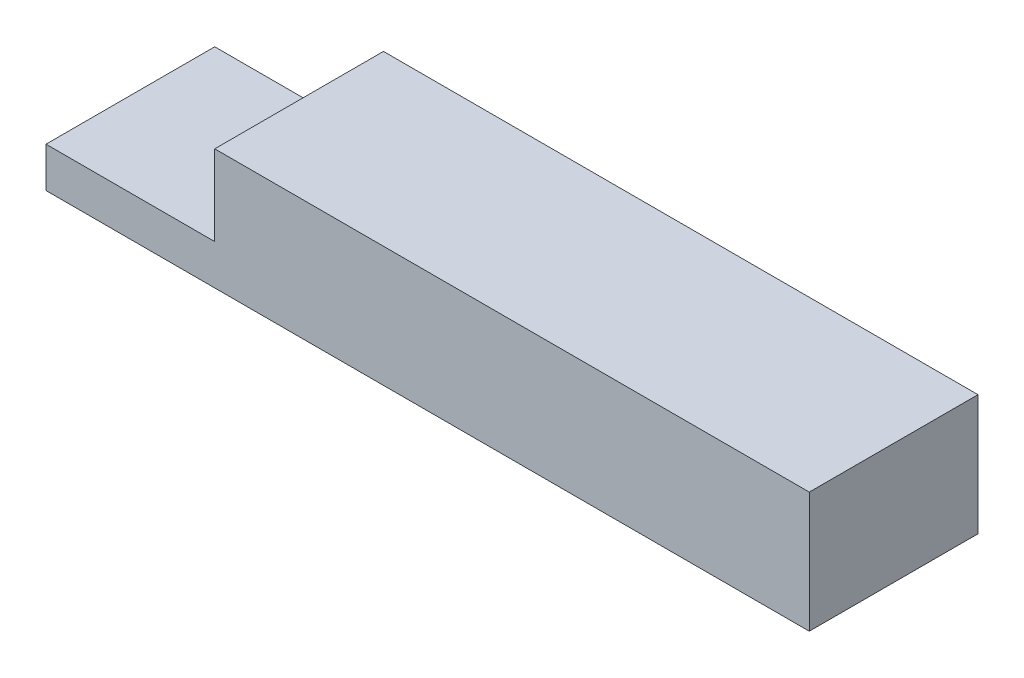
ISO-10303-21;
HEADER;
FILE_DESCRIPTION(('STEP AP214'),'2;1');
FILE_NAME('part.step','',(''),(''),'','','');
FILE_SCHEMA(('AUTOMOTIVE_DESIGN { 1 0 10303 214 1 1 1 1 }'));
ENDSEC;
DATA;
#1=APPLICATION_CONTEXT('core data for automotive mechanical design processes');
#2=APPLICATION_PROTOCOL_DEFINITION('international standard','automotive_design',2000,#1);
#3=PRODUCT_CONTEXT('',#1,'mechanical');
#4=PRODUCT('Part','Part','',(#3));
#5=PRODUCT_RELATED_PRODUCT_CATEGORY('part','',(#4));
#6=PRODUCT_DEFINITION_FORMATION('','',#4);
#7=PRODUCT_DEFINITION_CONTEXT('part definition',#1,'design');
#8=PRODUCT_DEFINITION('design','',#6,#7);
#9=PRODUCT_DEFINITION_SHAPE('','',#8);
#10=(LENGTH_UNIT() NAMED_UNIT(*) SI_UNIT(.MILLI.,.METRE.));
#11=(NAMED_UNIT(*) PLANE_ANGLE_UNIT() SI_UNIT($,.RADIAN.));
#12=(NAMED_UNIT(*) SI_UNIT($,.STERADIAN.) SOLID_ANGLE_UNIT());
#13=UNCERTAINTY_MEASURE_WITH_UNIT(LENGTH_MEASURE(1.E-05),#10,'distance_accuracy_value','');
#14=(GEOMETRIC_REPRESENTATION_CONTEXT(3) GLOBAL_UNCERTAINTY_ASSIGNED_CONTEXT((#13)) GLOBAL_UNIT_ASSIGNED_CONTEXT((#10,
#11,#12)) REPRESENTATION_CONTEXT('',''));
#15=CARTESIAN_POINT('',(0.,0.,0.));
#16=DIRECTION('',(0.,0.,1.));
#17=DIRECTION('',(1.,0.,0.));
#18=AXIS2_PLACEMENT_3D('',#15,#16,#17);
#19=CARTESIAN_POINT('',(0.,15.,-21.));
#20=DIRECTION('',(1.,0.,0.));
#21=DIRECTION('',(0.,0.,-1.));
#22=AXIS2_PLACEMENT_3D('',#19,#20,#21);
#23=PLANE('',#22);
#24=DIRECTION('',(0.,0.,1.));
#25=VECTOR('',#24,1.);
#26=CARTESIAN_POINT('',(0.,5.,-21.));
#27=LINE('',#26,#25);
#28=CARTESIAN_POINT('',(0.,5.,-21.));
#29=VERTEX_POINT('',#28);
#30=CARTESIAN_POINT('',(0.,5.,0.));
#31=VERTEX_POINT('',#30);
#32=EDGE_CURVE('E132',#29,#31,#27,.T.);
#33=ORIENTED_EDGE('',*,*,#32,.F.);
#34=DIRECTION('',(0.,-1.,0.));
#35=VECTOR('',#34,1.);
#36=CARTESIAN_POINT('',(0.,15.,-21.));
#37=LINE('',#36,#35);
#38=CARTESIAN_POINT('',(0.,0.,-21.));
#39=VERTEX_POINT('',#38);
#40=EDGE_CURVE('E11',#29,#39,#37,.T.);
#41=ORIENTED_EDGE('',*,*,#40,.T.);
#42=DIRECTION('',(0.,0.,1.));
#43=VECTOR('',#42,1.);
#44=CARTESIAN_POINT('',(0.,0.,-21.));
#45=LINE('',#44,#43);
#46=CARTESIAN_POINT('',(0.,0.,0.));
#47=VERTEX_POINT('',#46);
#48=EDGE_CURVE('E106',#39,#47,#45,.T.);
#49=ORIENTED_EDGE('',*,*,#48,.T.);
#50=DIRECTION('',(0.,-1.,0.));
#51=VECTOR('',#50,1.);
#52=CARTESIAN_POINT('',(0.,15.,0.));
#53=LINE('',#52,#51);
#54=EDGE_CURVE('E47',#31,#47,#53,.T.);
#55=ORIENTED_EDGE('',*,*,#54,.F.);
#56=EDGE_LOOP('',(#33,#41,#49,#55));
#57=FACE_BOUND('',#56,.T.);
#58=ADVANCED_FACE('F38',(#57),#23,.F.);
#59=CARTESIAN_POINT('',(95.,15.,-21.));
#60=DIRECTION('',(0.,0.,1.));
#61=DIRECTION('',(1.,0.,0.));
#62=AXIS2_PLACEMENT_3D('',#59,#60,#61);
#63=PLANE('',#62);
#64=DIRECTION('',(-1.,0.,0.));
#65=VECTOR('',#64,1.);
#66=CARTESIAN_POINT('',(21.,5.,-21.));
#67=LINE('',#66,#65);
#68=CARTESIAN_POINT('',(21.,5.,-21.));
#69=VERTEX_POINT('',#68);
#70=EDGE_CURVE('E135',#69,#29,#67,.T.);
#71=ORIENTED_EDGE('',*,*,#70,.F.);
#72=DIRECTION('',(0.,1.,0.));
#73=VECTOR('',#72,1.);
#74=CARTESIAN_POINT('',(21.,5.,-21.));
#75=LINE('',#74,#73);
#76=CARTESIAN_POINT('',(21.,15.,-21.));
#77=VERTEX_POINT('',#76);
#78=EDGE_CURVE('E108',#69,#77,#75,.T.);
#79=ORIENTED_EDGE('',*,*,#78,.T.);
#80=DIRECTION('',(-1.,0.,0.));
#81=VECTOR('',#80,1.);
#82=CARTESIAN_POINT('',(95.,15.,-21.));
#83=LINE('',#82,#81);
#84=CARTESIAN_POINT('',(95.,15.,-21.));
#85=VERTEX_POINT('',#84);
#86=EDGE_CURVE('E92',#85,#77,#83,.T.);
#87=ORIENTED_EDGE('',*,*,#86,.F.);
#88=DIRECTION('',(0.,-1.,0.));
#89=VECTOR('',#88,1.);
#90=CARTESIAN_POINT('',(95.,15.,-21.));
#91=LINE('',#90,#89);
#92=CARTESIAN_POINT('',(95.,0.,-21.));
#93=VERTEX_POINT('',#92);
#94=EDGE_CURVE('E84',#85,#93,#91,.T.);
#95=ORIENTED_EDGE('',*,*,#94,.T.);
#96=DIRECTION('',(-1.,0.,0.));
#97=VECTOR('',#96,1.);
#98=CARTESIAN_POINT('',(95.,0.,-21.));
#99=LINE('',#98,#97);
#100=EDGE_CURVE('E99',#93,#39,#99,.T.);
#101=ORIENTED_EDGE('',*,*,#100,.T.);
#102=ORIENTED_EDGE('',*,*,#40,.F.);
#103=EDGE_LOOP('',(#71,#79,#87,#95,#101,#102));
#104=FACE_BOUND('',#103,.T.);
#105=ADVANCED_FACE('F40',(#104),#63,.F.);
#106=CARTESIAN_POINT('',(0.,15.,0.));
#107=DIRECTION('',(0.,0.,-1.));
#108=DIRECTION('',(-1.,0.,0.));
#109=AXIS2_PLACEMENT_3D('',#106,#107,#108);
#110=PLANE('',#109);
#111=DIRECTION('',(1.,0.,0.));
#112=VECTOR('',#111,1.);
#113=CARTESIAN_POINT('',(0.,15.,0.));
#114=LINE('',#113,#112);
#115=CARTESIAN_POINT('',(21.,15.,0.));
#116=VERTEX_POINT('',#115);
#117=CARTESIAN_POINT('',(95.,15.,0.));
#118=VERTEX_POINT('',#117);
#119=EDGE_CURVE('E153',#116,#118,#114,.T.);
#120=ORIENTED_EDGE('',*,*,#119,.F.);
#121=DIRECTION('',(0.,1.,0.));
#122=VECTOR('',#121,1.);
#123=CARTESIAN_POINT('',(21.,5.,0.));
#124=LINE('',#123,#122);
#125=CARTESIAN_POINT('',(21.,5.,0.));
#126=VERTEX_POINT('',#125);
#127=EDGE_CURVE('E54',#126,#116,#124,.T.);
#128=ORIENTED_EDGE('',*,*,#127,.F.);
#129=DIRECTION('',(1.,0.,0.));
#130=VECTOR('',#129,1.);
#131=CARTESIAN_POINT('',(0.,5.,0.));
#132=LINE('',#131,#130);
#133=EDGE_CURVE('E128',#31,#126,#132,.T.);
#134=ORIENTED_EDGE('',*,*,#133,.F.);
#135=ORIENTED_EDGE('',*,*,#54,.T.);
#136=DIRECTION('',(1.,0.,0.));
#137=VECTOR('',#136,1.);
#138=CARTESIAN_POINT('',(0.,0.,0.));
#139=LINE('',#138,#137);
#140=CARTESIAN_POINT('',(95.,0.,0.));
#141=VERTEX_POINT('',#140);
#142=EDGE_CURVE('E93',#47,#141,#139,.T.);
#143=ORIENTED_EDGE('',*,*,#142,.T.);
#144=DIRECTION('',(0.,-1.,0.));
#145=VECTOR('',#144,1.);
#146=CARTESIAN_POINT('',(95.,15.,0.));
#147=LINE('',#146,#145);
#148=EDGE_CURVE('E87',#118,#141,#147,.T.);
#149=ORIENTED_EDGE('',*,*,#148,.F.);
#150=EDGE_LOOP('',(#120,#128,#134,#135,#143,#149));
#151=FACE_BOUND('',#150,.T.);
#152=ADVANCED_FACE('F125',(#151),#110,.F.);
#153=CARTESIAN_POINT('',(95.,15.,0.));
#154=DIRECTION('',(-1.,0.,0.));
#155=DIRECTION('',(0.,0.,1.));
#156=AXIS2_PLACEMENT_3D('',#153,#154,#155);
#157=PLANE('',#156);
#158=DIRECTION('',(0.,0.,-1.));
#159=VECTOR('',#158,1.);
#160=CARTESIAN_POINT('',(95.,0.,0.));
#161=LINE('',#160,#159);
#162=EDGE_CURVE('E81',#141,#93,#161,.T.);
#163=ORIENTED_EDGE('',*,*,#162,.T.);
#164=ORIENTED_EDGE('',*,*,#94,.F.);
#165=DIRECTION('',(0.,0.,-1.));
#166=VECTOR('',#165,1.);
#167=CARTESIAN_POINT('',(95.,15.,0.));
#168=LINE('',#167,#166);
#169=EDGE_CURVE('E63',#118,#85,#168,.T.);
#170=ORIENTED_EDGE('',*,*,#169,.F.);
#171=ORIENTED_EDGE('',*,*,#148,.T.);
#172=EDGE_LOOP('',(#163,#164,#170,#171));
#173=FACE_BOUND('',#172,.T.);
#174=ADVANCED_FACE('F83',(#173),#157,.F.);
#175=CARTESIAN_POINT('',(0.,15.,0.));
#176=DIRECTION('',(0.,1.,0.));
#177=DIRECTION('',(0.,0.,1.));
#178=AXIS2_PLACEMENT_3D('',#175,#176,#177);
#179=PLANE('',#178);
#180=DIRECTION('',(0.,0.,-1.));
#181=VECTOR('',#180,1.);
#182=CARTESIAN_POINT('',(21.,15.,0.));
#183=LINE('',#182,#181);
#184=EDGE_CURVE('E144',#116,#77,#183,.T.);
#185=ORIENTED_EDGE('',*,*,#184,.F.);
#186=ORIENTED_EDGE('',*,*,#119,.T.);
#187=ORIENTED_EDGE('',*,*,#169,.T.);
#188=ORIENTED_EDGE('',*,*,#86,.T.);
#189=EDGE_LOOP('',(#185,#186,#187,#188));
#190=FACE_BOUND('',#189,.T.);
#191=ADVANCED_FACE('F163',(#190),#179,.T.);
#192=CARTESIAN_POINT('',(0.,0.,0.));
#193=DIRECTION('',(0.,1.,0.));
#194=DIRECTION('',(0.,0.,1.));
#195=AXIS2_PLACEMENT_3D('',#192,#193,#194);
#196=PLANE('',#195);
#197=ORIENTED_EDGE('',*,*,#100,.F.);
#198=ORIENTED_EDGE('',*,*,#162,.F.);
#199=ORIENTED_EDGE('',*,*,#142,.F.);
#200=ORIENTED_EDGE('',*,*,#48,.F.);
#201=EDGE_LOOP('',(#197,#198,#199,#200));
#202=FACE_BOUND('',#201,.T.);
#203=ADVANCED_FACE('F104',(#202),#196,.F.);
#204=CARTESIAN_POINT('',(21.,5.,0.));
#205=DIRECTION('',(1.,0.,0.));
#206=DIRECTION('',(0.,0.,-1.));
#207=AXIS2_PLACEMENT_3D('',#204,#205,#206);
#208=PLANE('',#207);
#209=ORIENTED_EDGE('',*,*,#184,.T.);
#210=ORIENTED_EDGE('',*,*,#78,.F.);
#211=DIRECTION('',(0.,0.,-1.));
#212=VECTOR('',#211,1.);
#213=CARTESIAN_POINT('',(21.,5.,0.));
#214=LINE('',#213,#212);
#215=EDGE_CURVE('E146',#126,#69,#214,.T.);
#216=ORIENTED_EDGE('',*,*,#215,.F.);
#217=ORIENTED_EDGE('',*,*,#127,.T.);
#218=EDGE_LOOP('',(#209,#210,#216,#217));
#219=FACE_BOUND('',#218,.T.);
#220=ADVANCED_FACE('F147',(#219),#208,.F.);
#221=CARTESIAN_POINT('',(0.,5.,0.));
#222=DIRECTION('',(0.,1.,0.));
#223=DIRECTION('',(0.,0.,1.));
#224=AXIS2_PLACEMENT_3D('',#221,#222,#223);
#225=PLANE('',#224);
#226=ORIENTED_EDGE('',*,*,#32,.T.);
#227=ORIENTED_EDGE('',*,*,#133,.T.);
#228=ORIENTED_EDGE('',*,*,#215,.T.);
#229=ORIENTED_EDGE('',*,*,#70,.T.);
#230=EDGE_LOOP('',(#226,#227,#228,#229));
#231=FACE_BOUND('',#230,.T.);
#232=ADVANCED_FACE('F150',(#231),#225,.T.);
#233=CLOSED_SHELL('',(#58,#105,#152,#174,#191,#203,#220,#232));
#234=MANIFOLD_SOLID_BREP('B2',#233);
#235=ADVANCED_BREP_SHAPE_REPRESENTATION('',(#18,#234),#14);
#236=SHAPE_DEFINITION_REPRESENTATION(#9,#235);
ENDSEC;
END-ISO-10303-21;
